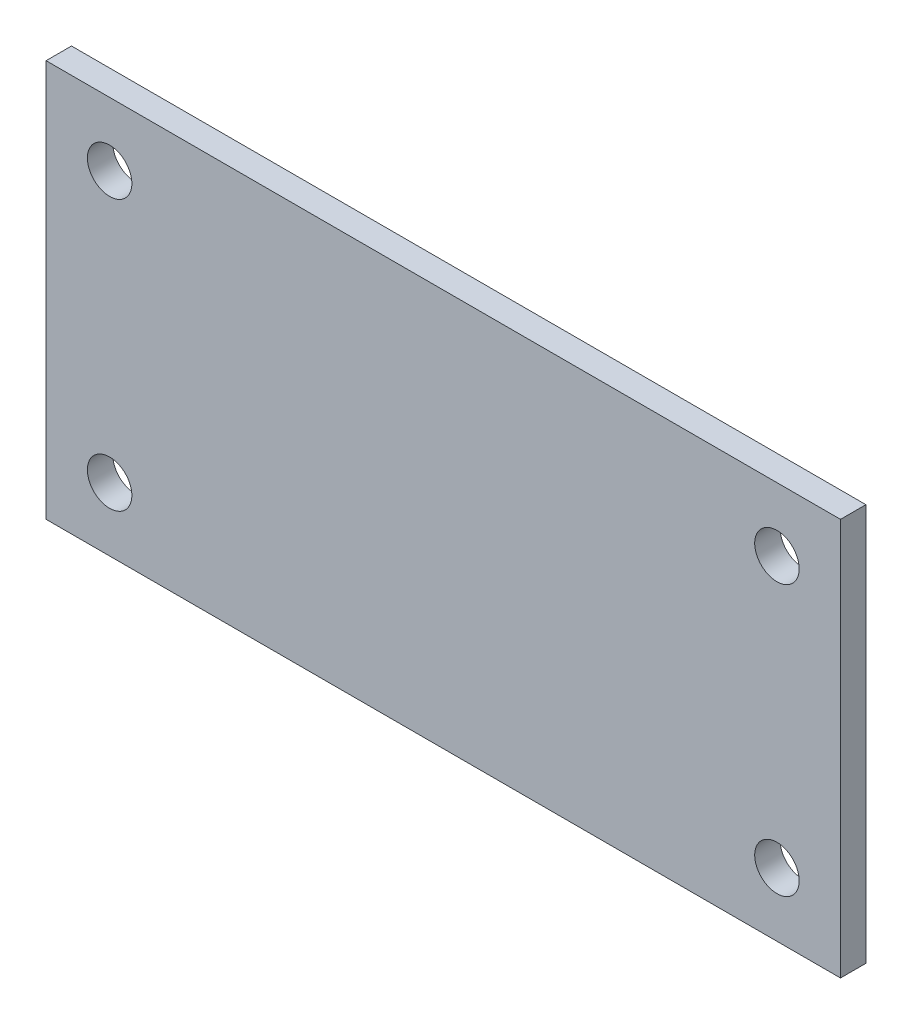
ISO-10303-21;
HEADER;
FILE_DESCRIPTION(('STEP AP214'),'2;1');
FILE_NAME('part.step','',(''),(''),'','','');
FILE_SCHEMA(('AUTOMOTIVE_DESIGN { 1 0 10303 214 1 1 1 1 }'));
ENDSEC;
DATA;
#1=APPLICATION_CONTEXT('core data for automotive mechanical design processes');
#2=APPLICATION_PROTOCOL_DEFINITION('international standard','automotive_design',2000,#1);
#3=PRODUCT_CONTEXT('',#1,'mechanical');
#4=PRODUCT('Part','Part','',(#3));
#5=PRODUCT_RELATED_PRODUCT_CATEGORY('part','',(#4));
#6=PRODUCT_DEFINITION_FORMATION('','',#4);
#7=PRODUCT_DEFINITION_CONTEXT('part definition',#1,'design');
#8=PRODUCT_DEFINITION('design','',#6,#7);
#9=PRODUCT_DEFINITION_SHAPE('','',#8);
#10=(LENGTH_UNIT() NAMED_UNIT(*) SI_UNIT(.MILLI.,.METRE.));
#11=(NAMED_UNIT(*) PLANE_ANGLE_UNIT() SI_UNIT($,.RADIAN.));
#12=(NAMED_UNIT(*) SI_UNIT($,.STERADIAN.) SOLID_ANGLE_UNIT());
#13=UNCERTAINTY_MEASURE_WITH_UNIT(LENGTH_MEASURE(1.E-05),#10,'distance_accuracy_value','');
#14=(GEOMETRIC_REPRESENTATION_CONTEXT(3) GLOBAL_UNCERTAINTY_ASSIGNED_CONTEXT((#13)) GLOBAL_UNIT_ASSIGNED_CONTEXT((#10,
#11,#12)) REPRESENTATION_CONTEXT('',''));
#15=CARTESIAN_POINT('',(0.,0.,0.));
#16=DIRECTION('',(0.,0.,1.));
#17=DIRECTION('',(1.,0.,0.));
#18=AXIS2_PLACEMENT_3D('',#15,#16,#17);
#19=CARTESIAN_POINT('',(-25.,-12.5,1.6));
#20=DIRECTION('',(1.,0.,0.));
#21=DIRECTION('',(0.,0.,-1.));
#22=AXIS2_PLACEMENT_3D('',#19,#20,#21);
#23=PLANE('',#22);
#24=DIRECTION('',(0.,-1.,0.));
#25=VECTOR('',#24,1.);
#26=CARTESIAN_POINT('',(-25.,-12.5,0.));
#27=LINE('',#26,#25);
#28=CARTESIAN_POINT('',(-25.,12.5,0.));
#29=VERTEX_POINT('',#28);
#30=CARTESIAN_POINT('',(-25.,-12.5,0.));
#31=VERTEX_POINT('',#30);
#32=EDGE_CURVE('E106',#29,#31,#27,.T.);
#33=ORIENTED_EDGE('',*,*,#32,.T.);
#34=DIRECTION('',(0.,0.,-1.));
#35=VECTOR('',#34,1.);
#36=CARTESIAN_POINT('',(-25.,-12.5,1.6));
#37=LINE('',#36,#35);
#38=CARTESIAN_POINT('',(-25.,-12.5,1.6));
#39=VERTEX_POINT('',#38);
#40=EDGE_CURVE('E11',#39,#31,#37,.T.);
#41=ORIENTED_EDGE('',*,*,#40,.F.);
#42=DIRECTION('',(0.,-1.,0.));
#43=VECTOR('',#42,1.);
#44=CARTESIAN_POINT('',(-25.,-12.5,1.6));
#45=LINE('',#44,#43);
#46=CARTESIAN_POINT('',(-25.,12.5,1.6));
#47=VERTEX_POINT('',#46);
#48=EDGE_CURVE('E94',#47,#39,#45,.T.);
#49=ORIENTED_EDGE('',*,*,#48,.F.);
#50=DIRECTION('',(0.,0.,-1.));
#51=VECTOR('',#50,1.);
#52=CARTESIAN_POINT('',(-25.,12.5,1.6));
#53=LINE('',#52,#51);
#54=EDGE_CURVE('E102',#47,#29,#53,.T.);
#55=ORIENTED_EDGE('',*,*,#54,.T.);
#56=EDGE_LOOP('',(#33,#41,#49,#55));
#57=FACE_BOUND('',#56,.T.);
#58=ADVANCED_FACE('F43',(#57),#23,.F.);
#59=CARTESIAN_POINT('',(-25.,-12.5,1.6));
#60=DIRECTION('',(0.,1.,0.));
#61=DIRECTION('',(0.,0.,1.));
#62=AXIS2_PLACEMENT_3D('',#59,#60,#61);
#63=PLANE('',#62);
#64=DIRECTION('',(1.,0.,0.));
#65=VECTOR('',#64,1.);
#66=CARTESIAN_POINT('',(-25.,-12.5,0.));
#67=LINE('',#66,#65);
#68=CARTESIAN_POINT('',(25.,-12.5,0.));
#69=VERTEX_POINT('',#68);
#70=EDGE_CURVE('E98',#31,#69,#67,.T.);
#71=ORIENTED_EDGE('',*,*,#70,.T.);
#72=DIRECTION('',(0.,0.,-1.));
#73=VECTOR('',#72,1.);
#74=CARTESIAN_POINT('',(25.,-12.5,1.6));
#75=LINE('',#74,#73);
#76=CARTESIAN_POINT('',(25.,-12.5,1.6));
#77=VERTEX_POINT('',#76);
#78=EDGE_CURVE('E51',#77,#69,#75,.T.);
#79=ORIENTED_EDGE('',*,*,#78,.F.);
#80=DIRECTION('',(1.,0.,0.));
#81=VECTOR('',#80,1.);
#82=CARTESIAN_POINT('',(-25.,-12.5,1.6));
#83=LINE('',#82,#81);
#84=EDGE_CURVE('E89',#39,#77,#83,.T.);
#85=ORIENTED_EDGE('',*,*,#84,.F.);
#86=ORIENTED_EDGE('',*,*,#40,.T.);
#87=EDGE_LOOP('',(#71,#79,#85,#86));
#88=FACE_BOUND('',#87,.T.);
#89=ADVANCED_FACE('F97',(#88),#63,.F.);
#90=CARTESIAN_POINT('',(25.,-12.5,1.6));
#91=DIRECTION('',(-1.,0.,0.));
#92=DIRECTION('',(0.,0.,1.));
#93=AXIS2_PLACEMENT_3D('',#90,#91,#92);
#94=PLANE('',#93);
#95=DIRECTION('',(0.,1.,0.));
#96=VECTOR('',#95,1.);
#97=CARTESIAN_POINT('',(25.,-12.5,0.));
#98=LINE('',#97,#96);
#99=CARTESIAN_POINT('',(25.,12.5,0.));
#100=VERTEX_POINT('',#99);
#101=EDGE_CURVE('E76',#69,#100,#98,.T.);
#102=ORIENTED_EDGE('',*,*,#101,.T.);
#103=DIRECTION('',(0.,0.,-1.));
#104=VECTOR('',#103,1.);
#105=CARTESIAN_POINT('',(25.,12.5,1.6));
#106=LINE('',#105,#104);
#107=CARTESIAN_POINT('',(25.,12.5,1.6));
#108=VERTEX_POINT('',#107);
#109=EDGE_CURVE('E99',#108,#100,#106,.T.);
#110=ORIENTED_EDGE('',*,*,#109,.F.);
#111=DIRECTION('',(0.,1.,0.));
#112=VECTOR('',#111,1.);
#113=CARTESIAN_POINT('',(25.,-12.5,1.6));
#114=LINE('',#113,#112);
#115=EDGE_CURVE('E92',#77,#108,#114,.T.);
#116=ORIENTED_EDGE('',*,*,#115,.F.);
#117=ORIENTED_EDGE('',*,*,#78,.T.);
#118=EDGE_LOOP('',(#102,#110,#116,#117));
#119=FACE_BOUND('',#118,.T.);
#120=ADVANCED_FACE('F100',(#119),#94,.F.);
#121=CARTESIAN_POINT('',(-25.,12.5,1.6));
#122=DIRECTION('',(0.,-1.,0.));
#123=DIRECTION('',(0.,0.,-1.));
#124=AXIS2_PLACEMENT_3D('',#121,#122,#123);
#125=PLANE('',#124);
#126=DIRECTION('',(-1.,0.,0.));
#127=VECTOR('',#126,1.);
#128=CARTESIAN_POINT('',(-25.,12.5,0.));
#129=LINE('',#128,#127);
#130=EDGE_CURVE('E82',#100,#29,#129,.T.);
#131=ORIENTED_EDGE('',*,*,#130,.T.);
#132=ORIENTED_EDGE('',*,*,#54,.F.);
#133=DIRECTION('',(-1.,0.,0.));
#134=VECTOR('',#133,1.);
#135=CARTESIAN_POINT('',(-25.,12.5,1.6));
#136=LINE('',#135,#134);
#137=EDGE_CURVE('E59',#108,#47,#136,.T.);
#138=ORIENTED_EDGE('',*,*,#137,.F.);
#139=ORIENTED_EDGE('',*,*,#109,.T.);
#140=EDGE_LOOP('',(#131,#132,#138,#139));
#141=FACE_BOUND('',#140,.T.);
#142=ADVANCED_FACE('F114',(#141),#125,.F.);
#143=CARTESIAN_POINT('',(0.,0.,1.6));
#144=DIRECTION('',(0.,0.,-1.));
#145=DIRECTION('',(-1.,0.,0.));
#146=AXIS2_PLACEMENT_3D('',#143,#144,#145);
#147=PLANE('',#146);
#148=CARTESIAN_POINT('',(-21.,8.5,1.6));
#149=DIRECTION('',(0.,0.,1.));
#150=DIRECTION('',(1.,0.,0.));
#151=AXIS2_PLACEMENT_3D('',#148,#149,#150);
#152=CIRCLE('',#151,1.4);
#153=CARTESIAN_POINT('',(-19.6,8.5,1.6));
#154=VERTEX_POINT('',#153);
#155=EDGE_CURVE('E133',#154,#154,#152,.T.);
#156=ORIENTED_EDGE('',*,*,#155,.F.);
#157=EDGE_LOOP('',(#156));
#158=FACE_BOUND('',#157,.T.);
#159=CARTESIAN_POINT('',(21.,-8.5,1.6));
#160=DIRECTION('',(0.,0.,1.));
#161=DIRECTION('',(1.,0.,0.));
#162=AXIS2_PLACEMENT_3D('',#159,#160,#161);
#163=CIRCLE('',#162,1.4);
#164=CARTESIAN_POINT('',(22.4,-8.5,1.6));
#165=VERTEX_POINT('',#164);
#166=EDGE_CURVE('E126',#165,#165,#163,.T.);
#167=ORIENTED_EDGE('',*,*,#166,.F.);
#168=EDGE_LOOP('',(#167));
#169=FACE_BOUND('',#168,.T.);
#170=CARTESIAN_POINT('',(21.,8.5,1.6));
#171=DIRECTION('',(0.,0.,1.));
#172=DIRECTION('',(1.,0.,0.));
#173=AXIS2_PLACEMENT_3D('',#170,#171,#172);
#174=CIRCLE('',#173,1.4);
#175=CARTESIAN_POINT('',(22.4,8.5,1.6));
#176=VERTEX_POINT('',#175);
#177=EDGE_CURVE('E138',#176,#176,#174,.T.);
#178=ORIENTED_EDGE('',*,*,#177,.F.);
#179=EDGE_LOOP('',(#178));
#180=FACE_BOUND('',#179,.T.);
#181=CARTESIAN_POINT('',(-21.,-8.5,1.6));
#182=DIRECTION('',(0.,0.,1.));
#183=DIRECTION('',(1.,0.,0.));
#184=AXIS2_PLACEMENT_3D('',#181,#182,#183);
#185=CIRCLE('',#184,1.4);
#186=CARTESIAN_POINT('',(-19.6,-8.5,1.6));
#187=VERTEX_POINT('',#186);
#188=EDGE_CURVE('E109',#187,#187,#185,.T.);
#189=ORIENTED_EDGE('',*,*,#188,.F.);
#190=EDGE_LOOP('',(#189));
#191=FACE_BOUND('',#190,.T.);
#192=ORIENTED_EDGE('',*,*,#48,.T.);
#193=ORIENTED_EDGE('',*,*,#84,.T.);
#194=ORIENTED_EDGE('',*,*,#115,.T.);
#195=ORIENTED_EDGE('',*,*,#137,.T.);
#196=EDGE_LOOP('',(#192,#193,#194,#195));
#197=FACE_BOUND('',#196,.T.);
#198=ADVANCED_FACE('F90',(#158,#169,#180,#191,#197),#147,.F.);
#199=CARTESIAN_POINT('',(0.,0.,0.));
#200=DIRECTION('',(0.,0.,-1.));
#201=DIRECTION('',(-1.,0.,0.));
#202=AXIS2_PLACEMENT_3D('',#199,#200,#201);
#203=PLANE('',#202);
#204=CARTESIAN_POINT('',(-21.,8.5,0.));
#205=DIRECTION('',(0.,0.,1.));
#206=DIRECTION('',(1.,0.,0.));
#207=AXIS2_PLACEMENT_3D('',#204,#205,#206);
#208=CIRCLE('',#207,1.4);
#209=CARTESIAN_POINT('',(-19.6,8.5,0.));
#210=VERTEX_POINT('',#209);
#211=EDGE_CURVE('E123',#210,#210,#208,.T.);
#212=ORIENTED_EDGE('',*,*,#211,.T.);
#213=EDGE_LOOP('',(#212));
#214=FACE_BOUND('',#213,.T.);
#215=CARTESIAN_POINT('',(21.,-8.5,0.));
#216=DIRECTION('',(0.,0.,1.));
#217=DIRECTION('',(1.,0.,0.));
#218=AXIS2_PLACEMENT_3D('',#215,#216,#217);
#219=CIRCLE('',#218,1.4);
#220=CARTESIAN_POINT('',(22.4,-8.5,0.));
#221=VERTEX_POINT('',#220);
#222=EDGE_CURVE('E129',#221,#221,#219,.T.);
#223=ORIENTED_EDGE('',*,*,#222,.T.);
#224=EDGE_LOOP('',(#223));
#225=FACE_BOUND('',#224,.T.);
#226=CARTESIAN_POINT('',(21.,8.5,0.));
#227=DIRECTION('',(0.,0.,1.));
#228=DIRECTION('',(1.,0.,0.));
#229=AXIS2_PLACEMENT_3D('',#226,#227,#228);
#230=CIRCLE('',#229,1.4);
#231=CARTESIAN_POINT('',(22.4,8.5,0.));
#232=VERTEX_POINT('',#231);
#233=EDGE_CURVE('E130',#232,#232,#230,.T.);
#234=ORIENTED_EDGE('',*,*,#233,.T.);
#235=EDGE_LOOP('',(#234));
#236=FACE_BOUND('',#235,.T.);
#237=CARTESIAN_POINT('',(-21.,-8.5,0.));
#238=DIRECTION('',(0.,0.,1.));
#239=DIRECTION('',(1.,0.,0.));
#240=AXIS2_PLACEMENT_3D('',#237,#238,#239);
#241=CIRCLE('',#240,1.4);
#242=CARTESIAN_POINT('',(-19.6,-8.5,0.));
#243=VERTEX_POINT('',#242);
#244=EDGE_CURVE('E120',#243,#243,#241,.T.);
#245=ORIENTED_EDGE('',*,*,#244,.T.);
#246=EDGE_LOOP('',(#245));
#247=FACE_BOUND('',#246,.T.);
#248=ORIENTED_EDGE('',*,*,#32,.F.);
#249=ORIENTED_EDGE('',*,*,#130,.F.);
#250=ORIENTED_EDGE('',*,*,#101,.F.);
#251=ORIENTED_EDGE('',*,*,#70,.F.);
#252=EDGE_LOOP('',(#248,#249,#250,#251));
#253=FACE_BOUND('',#252,.T.);
#254=ADVANCED_FACE('F117',(#214,#225,#236,#247,#253),#203,.T.);
#255=CARTESIAN_POINT('',(-21.,-8.5,1.6));
#256=DIRECTION('',(0.,0.,-1.));
#257=DIRECTION('',(-1.,0.,0.));
#258=AXIS2_PLACEMENT_3D('',#255,#256,#257);
#259=CYLINDRICAL_SURFACE('',#258,1.4);
#260=ORIENTED_EDGE('',*,*,#188,.T.);
#261=EDGE_LOOP('',(#260));
#262=FACE_BOUND('',#261,.T.);
#263=ORIENTED_EDGE('',*,*,#244,.F.);
#264=EDGE_LOOP('',(#263));
#265=FACE_BOUND('',#264,.T.);
#266=ADVANCED_FACE('F149',(#262,#265),#259,.F.);
#267=CARTESIAN_POINT('',(21.,8.5,1.6));
#268=DIRECTION('',(0.,0.,-1.));
#269=DIRECTION('',(-1.,0.,0.));
#270=AXIS2_PLACEMENT_3D('',#267,#268,#269);
#271=CYLINDRICAL_SURFACE('',#270,1.4);
#272=ORIENTED_EDGE('',*,*,#177,.T.);
#273=EDGE_LOOP('',(#272));
#274=FACE_BOUND('',#273,.T.);
#275=ORIENTED_EDGE('',*,*,#233,.F.);
#276=EDGE_LOOP('',(#275));
#277=FACE_BOUND('',#276,.T.);
#278=ADVANCED_FACE('F146',(#274,#277),#271,.F.);
#279=CARTESIAN_POINT('',(21.,-8.5,1.6));
#280=DIRECTION('',(0.,0.,-1.));
#281=DIRECTION('',(-1.,0.,0.));
#282=AXIS2_PLACEMENT_3D('',#279,#280,#281);
#283=CYLINDRICAL_SURFACE('',#282,1.4);
#284=ORIENTED_EDGE('',*,*,#166,.T.);
#285=EDGE_LOOP('',(#284));
#286=FACE_BOUND('',#285,.T.);
#287=ORIENTED_EDGE('',*,*,#222,.F.);
#288=EDGE_LOOP('',(#287));
#289=FACE_BOUND('',#288,.T.);
#290=ADVANCED_FACE('F148',(#286,#289),#283,.F.);
#291=CARTESIAN_POINT('',(-21.,8.5,1.6));
#292=DIRECTION('',(0.,0.,-1.));
#293=DIRECTION('',(-1.,0.,0.));
#294=AXIS2_PLACEMENT_3D('',#291,#292,#293);
#295=CYLINDRICAL_SURFACE('',#294,1.4);
#296=ORIENTED_EDGE('',*,*,#155,.T.);
#297=EDGE_LOOP('',(#296));
#298=FACE_BOUND('',#297,.T.);
#299=ORIENTED_EDGE('',*,*,#211,.F.);
#300=EDGE_LOOP('',(#299));
#301=FACE_BOUND('',#300,.T.);
#302=ADVANCED_FACE('F156',(#298,#301),#295,.F.);
#303=CLOSED_SHELL('',(#58,#89,#120,#142,#198,#254,#266,#278,#290,#302));
#304=MANIFOLD_SOLID_BREP('B2',#303);
#305=ADVANCED_BREP_SHAPE_REPRESENTATION('',(#18,#304),#14);
#306=SHAPE_DEFINITION_REPRESENTATION(#9,#305);
ENDSEC;
END-ISO-10303-21;
